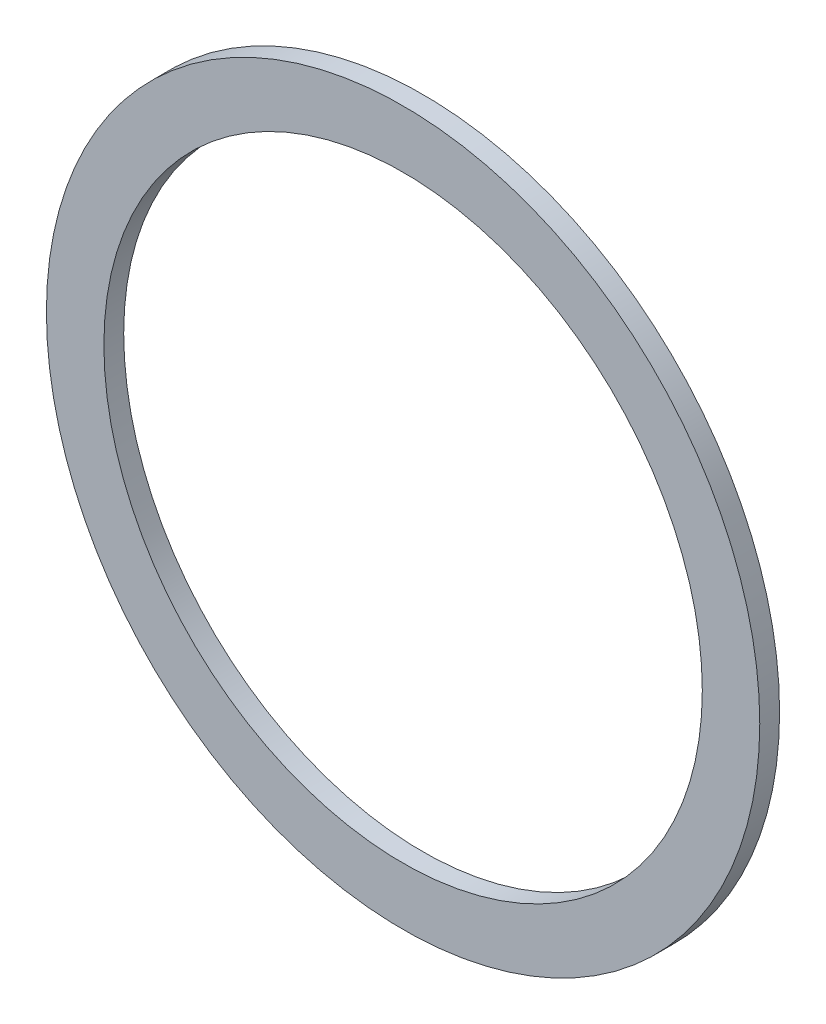
ISO-10303-21;
HEADER;
FILE_DESCRIPTION(('STEP AP214'),'2;1');
FILE_NAME('part.step','',(''),(''),'','','');
FILE_SCHEMA(('AUTOMOTIVE_DESIGN { 1 0 10303 214 1 1 1 1 }'));
ENDSEC;
DATA;
#1=APPLICATION_CONTEXT('core data for automotive mechanical design processes');
#2=APPLICATION_PROTOCOL_DEFINITION('international standard','automotive_design',2000,#1);
#3=PRODUCT_CONTEXT('',#1,'mechanical');
#4=PRODUCT('Part','Part','',(#3));
#5=PRODUCT_RELATED_PRODUCT_CATEGORY('part','',(#4));
#6=PRODUCT_DEFINITION_FORMATION('','',#4);
#7=PRODUCT_DEFINITION_CONTEXT('part definition',#1,'design');
#8=PRODUCT_DEFINITION('design','',#6,#7);
#9=PRODUCT_DEFINITION_SHAPE('','',#8);
#10=(LENGTH_UNIT() NAMED_UNIT(*) SI_UNIT(.MILLI.,.METRE.));
#11=(NAMED_UNIT(*) PLANE_ANGLE_UNIT() SI_UNIT($,.RADIAN.));
#12=(NAMED_UNIT(*) SI_UNIT($,.STERADIAN.) SOLID_ANGLE_UNIT());
#13=UNCERTAINTY_MEASURE_WITH_UNIT(LENGTH_MEASURE(1.E-05),#10,'distance_accuracy_value','');
#14=(GEOMETRIC_REPRESENTATION_CONTEXT(3) GLOBAL_UNCERTAINTY_ASSIGNED_CONTEXT((#13)) GLOBAL_UNIT_ASSIGNED_CONTEXT((#10,
#11,#12)) REPRESENTATION_CONTEXT('',''));
#15=CARTESIAN_POINT('',(0.,0.,0.));
#16=DIRECTION('',(0.,0.,1.));
#17=DIRECTION('',(1.,0.,0.));
#18=AXIS2_PLACEMENT_3D('',#15,#16,#17);
#19=CARTESIAN_POINT('',(0.,0.,1.));
#20=DIRECTION('',(0.,0.,1.));
#21=DIRECTION('',(1.,0.,0.));
#22=AXIS2_PLACEMENT_3D('',#19,#20,#21);
#23=PLANE('',#22);
#24=CARTESIAN_POINT('',(0.,0.,1.));
#25=DIRECTION('',(0.,0.,1.));
#26=DIRECTION('',(1.,0.,0.));
#27=AXIS2_PLACEMENT_3D('',#24,#25,#26);
#28=CIRCLE('',#27,18.);
#29=CARTESIAN_POINT('',(18.,0.,1.));
#30=VERTEX_POINT('',#29);
#31=EDGE_CURVE('E10',#30,#30,#28,.T.);
#32=ORIENTED_EDGE('',*,*,#31,.T.);
#33=EDGE_LOOP('',(#32));
#34=FACE_BOUND('',#33,.T.);
#35=CARTESIAN_POINT('',(0.,0.,1.));
#36=DIRECTION('',(0.,0.,1.));
#37=DIRECTION('',(1.,0.,0.));
#38=AXIS2_PLACEMENT_3D('',#35,#36,#37);
#39=CIRCLE('',#38,15.1);
#40=CARTESIAN_POINT('',(15.1,0.,1.));
#41=VERTEX_POINT('',#40);
#42=EDGE_CURVE('E57',#41,#41,#39,.T.);
#43=ORIENTED_EDGE('',*,*,#42,.F.);
#44=EDGE_LOOP('',(#43));
#45=FACE_BOUND('',#44,.T.);
#46=ADVANCED_FACE('F43',(#34,#45),#23,.T.);
#47=CARTESIAN_POINT('',(0.,0.,0.));
#48=DIRECTION('',(0.,0.,1.));
#49=DIRECTION('',(1.,0.,0.));
#50=AXIS2_PLACEMENT_3D('',#47,#48,#49);
#51=PLANE('',#50);
#52=CARTESIAN_POINT('',(0.,0.,0.));
#53=DIRECTION('',(0.,0.,1.));
#54=DIRECTION('',(1.,0.,0.));
#55=AXIS2_PLACEMENT_3D('',#52,#53,#54);
#56=CIRCLE('',#55,18.);
#57=CARTESIAN_POINT('',(18.,0.,0.));
#58=VERTEX_POINT('',#57);
#59=EDGE_CURVE('E50',#58,#58,#56,.T.);
#60=ORIENTED_EDGE('',*,*,#59,.F.);
#61=EDGE_LOOP('',(#60));
#62=FACE_BOUND('',#61,.T.);
#63=CARTESIAN_POINT('',(0.,0.,0.));
#64=DIRECTION('',(0.,0.,1.));
#65=DIRECTION('',(1.,0.,0.));
#66=AXIS2_PLACEMENT_3D('',#63,#64,#65);
#67=CIRCLE('',#66,15.1);
#68=CARTESIAN_POINT('',(15.1,0.,0.));
#69=VERTEX_POINT('',#68);
#70=EDGE_CURVE('E59',#69,#69,#67,.T.);
#71=ORIENTED_EDGE('',*,*,#70,.T.);
#72=EDGE_LOOP('',(#71));
#73=FACE_BOUND('',#72,.T.);
#74=ADVANCED_FACE('F68',(#62,#73),#51,.F.);
#75=CARTESIAN_POINT('',(0.,0.,1.));
#76=DIRECTION('',(0.,0.,-1.));
#77=DIRECTION('',(-1.,0.,0.));
#78=AXIS2_PLACEMENT_3D('',#75,#76,#77);
#79=CYLINDRICAL_SURFACE('',#78,18.);
#80=ORIENTED_EDGE('',*,*,#31,.F.);
#81=EDGE_LOOP('',(#80));
#82=FACE_BOUND('',#81,.T.);
#83=ORIENTED_EDGE('',*,*,#59,.T.);
#84=EDGE_LOOP('',(#83));
#85=FACE_BOUND('',#84,.T.);
#86=ADVANCED_FACE('F44',(#82,#85),#79,.T.);
#87=CARTESIAN_POINT('',(0.,0.,1.));
#88=DIRECTION('',(0.,0.,-1.));
#89=DIRECTION('',(-1.,0.,0.));
#90=AXIS2_PLACEMENT_3D('',#87,#88,#89);
#91=CYLINDRICAL_SURFACE('',#90,15.1);
#92=ORIENTED_EDGE('',*,*,#42,.T.);
#93=EDGE_LOOP('',(#92));
#94=FACE_BOUND('',#93,.T.);
#95=ORIENTED_EDGE('',*,*,#70,.F.);
#96=EDGE_LOOP('',(#95));
#97=FACE_BOUND('',#96,.T.);
#98=ADVANCED_FACE('F67',(#94,#97),#91,.F.);
#99=CLOSED_SHELL('',(#46,#74,#86,#98));
#100=MANIFOLD_SOLID_BREP('B2',#99);
#101=ADVANCED_BREP_SHAPE_REPRESENTATION('',(#18,#100),#14);
#102=SHAPE_DEFINITION_REPRESENTATION(#9,#101);
ENDSEC;
END-ISO-10303-21;
